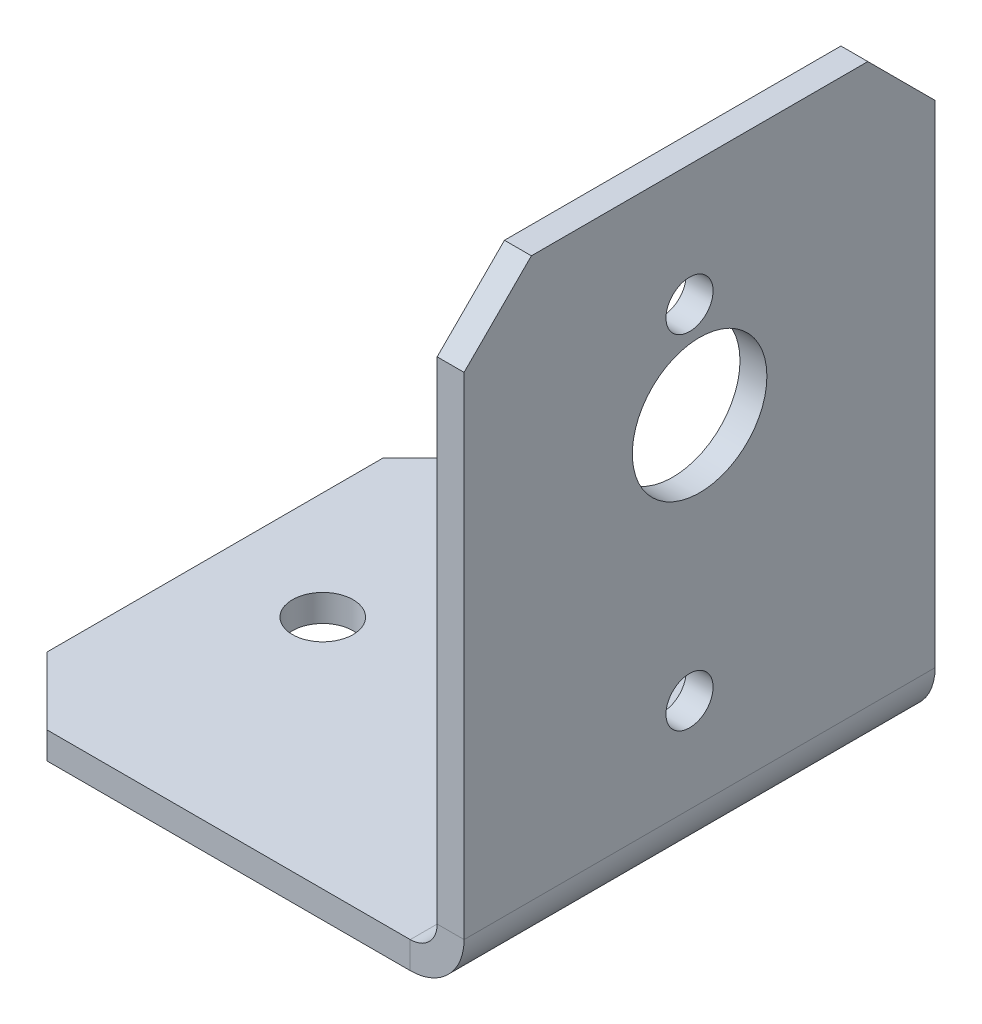
ISO-10303-21;
HEADER;
FILE_DESCRIPTION(('STEP AP214'),'2;1');
FILE_NAME('part.step','',(''),(''),'','','');
FILE_SCHEMA(('AUTOMOTIVE_DESIGN { 1 0 10303 214 1 1 1 1 }'));
ENDSEC;
DATA;
#1=APPLICATION_CONTEXT('core data for automotive mechanical design processes');
#2=APPLICATION_PROTOCOL_DEFINITION('international standard','automotive_design',2000,#1);
#3=PRODUCT_CONTEXT('',#1,'mechanical');
#4=PRODUCT('Part','Part','',(#3));
#5=PRODUCT_RELATED_PRODUCT_CATEGORY('part','',(#4));
#6=PRODUCT_DEFINITION_FORMATION('','',#4);
#7=PRODUCT_DEFINITION_CONTEXT('part definition',#1,'design');
#8=PRODUCT_DEFINITION('design','',#6,#7);
#9=PRODUCT_DEFINITION_SHAPE('','',#8);
#10=(LENGTH_UNIT() NAMED_UNIT(*) SI_UNIT(.MILLI.,.METRE.));
#11=(NAMED_UNIT(*) PLANE_ANGLE_UNIT() SI_UNIT($,.RADIAN.));
#12=(NAMED_UNIT(*) SI_UNIT($,.STERADIAN.) SOLID_ANGLE_UNIT());
#13=UNCERTAINTY_MEASURE_WITH_UNIT(LENGTH_MEASURE(1.E-05),#10,'distance_accuracy_value','');
#14=(GEOMETRIC_REPRESENTATION_CONTEXT(3) GLOBAL_UNCERTAINTY_ASSIGNED_CONTEXT((#13)) GLOBAL_UNIT_ASSIGNED_CONTEXT((#10,
#11,#12)) REPRESENTATION_CONTEXT('',''));
#15=CARTESIAN_POINT('',(0.,0.,0.));
#16=DIRECTION('',(0.,0.,1.));
#17=DIRECTION('',(1.,0.,0.));
#18=AXIS2_PLACEMENT_3D('',#15,#16,#17);
#19=CARTESIAN_POINT('',(-4.,0.,35.));
#20=DIRECTION('',(0.,0.,1.));
#21=DIRECTION('',(1.,0.,0.));
#22=AXIS2_PLACEMENT_3D('',#19,#20,#21);
#23=PLANE('',#22);
#24=DIRECTION('',(0.,1.,0.));
#25=VECTOR('',#24,1.);
#26=CARTESIAN_POINT('',(-4.,0.,35.));
#27=LINE('',#26,#25);
#28=CARTESIAN_POINT('',(-4.,0.,35.));
#29=VERTEX_POINT('',#28);
#30=CARTESIAN_POINT('',(-4.,2.,35.));
#31=VERTEX_POINT('',#30);
#32=EDGE_CURVE('E124',#29,#31,#27,.T.);
#33=ORIENTED_EDGE('',*,*,#32,.F.);
#34=CARTESIAN_POINT('',(-4.,4.,35.));
#35=DIRECTION('',(0.,0.,1.));
#36=DIRECTION('',(1.,0.,0.));
#37=AXIS2_PLACEMENT_3D('',#34,#35,#36);
#38=CIRCLE('',#37,4.);
#39=CARTESIAN_POINT('',(0.,4.,35.));
#40=VERTEX_POINT('',#39);
#41=EDGE_CURVE('E128',#40,#29,#38,.F.);
#42=ORIENTED_EDGE('',*,*,#41,.F.);
#43=DIRECTION('',(1.,0.,0.));
#44=VECTOR('',#43,1.);
#45=CARTESIAN_POINT('',(-2.,4.,35.));
#46=LINE('',#45,#44);
#47=CARTESIAN_POINT('',(-2.,4.,35.));
#48=VERTEX_POINT('',#47);
#49=EDGE_CURVE('E136',#48,#40,#46,.T.);
#50=ORIENTED_EDGE('',*,*,#49,.F.);
#51=CARTESIAN_POINT('',(-4.,4.,35.));
#52=DIRECTION('',(0.,0.,1.));
#53=DIRECTION('',(1.,0.,0.));
#54=AXIS2_PLACEMENT_3D('',#51,#52,#53);
#55=CIRCLE('',#54,2.);
#56=EDGE_CURVE('E130',#48,#31,#55,.F.);
#57=ORIENTED_EDGE('',*,*,#56,.T.);
#58=EDGE_LOOP('',(#33,#42,#50,#57));
#59=FACE_BOUND('',#58,.T.);
#60=ADVANCED_FACE('F34',(#59),#23,.T.);
#61=CARTESIAN_POINT('',(-2.,4.,35.));
#62=DIRECTION('',(0.,0.,1.));
#63=DIRECTION('',(1.,0.,0.));
#64=AXIS2_PLACEMENT_3D('',#61,#62,#63);
#65=PLANE('',#64);
#66=DIRECTION('',(-1.,0.,0.));
#67=VECTOR('',#66,1.);
#68=CARTESIAN_POINT('',(0.,2.,35.));
#69=LINE('',#68,#67);
#70=CARTESIAN_POINT('',(-31.,2.,35.));
#71=VERTEX_POINT('',#70);
#72=EDGE_CURVE('E158',#31,#71,#69,.T.);
#73=ORIENTED_EDGE('',*,*,#72,.T.);
#74=DIRECTION('',(0.,-1.,0.));
#75=VECTOR('',#74,1.);
#76=CARTESIAN_POINT('',(-31.,4.,35.));
#77=LINE('',#76,#75);
#78=CARTESIAN_POINT('',(-31.,0.,35.));
#79=VERTEX_POINT('',#78);
#80=EDGE_CURVE('E157',#71,#79,#77,.T.);
#81=ORIENTED_EDGE('',*,*,#80,.T.);
#82=DIRECTION('',(-1.,0.,0.));
#83=VECTOR('',#82,1.);
#84=CARTESIAN_POINT('',(0.,0.,35.));
#85=LINE('',#84,#83);
#86=EDGE_CURVE('E145',#29,#79,#85,.T.);
#87=ORIENTED_EDGE('',*,*,#86,.F.);
#88=ORIENTED_EDGE('',*,*,#32,.T.);
#89=EDGE_LOOP('',(#73,#81,#87,#88));
#90=FACE_BOUND('',#89,.T.);
#91=ADVANCED_FACE('F155',(#90),#65,.T.);
#92=CARTESIAN_POINT('',(0.,4.,0.));
#93=DIRECTION('',(0.,0.,-1.));
#94=DIRECTION('',(-1.,0.,0.));
#95=AXIS2_PLACEMENT_3D('',#92,#93,#94);
#96=PLANE('',#95);
#97=DIRECTION('',(-1.,0.,0.));
#98=VECTOR('',#97,1.);
#99=CARTESIAN_POINT('',(0.,4.,0.));
#100=LINE('',#99,#98);
#101=CARTESIAN_POINT('',(0.,4.,0.));
#102=VERTEX_POINT('',#101);
#103=CARTESIAN_POINT('',(-2.,4.,0.));
#104=VERTEX_POINT('',#103);
#105=EDGE_CURVE('E202',#102,#104,#100,.T.);
#106=ORIENTED_EDGE('',*,*,#105,.F.);
#107=CARTESIAN_POINT('',(-4.,4.,0.));
#108=DIRECTION('',(0.,0.,1.));
#109=DIRECTION('',(1.,0.,0.));
#110=AXIS2_PLACEMENT_3D('',#107,#108,#109);
#111=CIRCLE('',#110,4.);
#112=CARTESIAN_POINT('',(-4.,0.,0.));
#113=VERTEX_POINT('',#112);
#114=EDGE_CURVE('E177',#102,#113,#111,.F.);
#115=ORIENTED_EDGE('',*,*,#114,.T.);
#116=DIRECTION('',(0.,-1.,0.));
#117=VECTOR('',#116,1.);
#118=CARTESIAN_POINT('',(-4.,2.,0.));
#119=LINE('',#118,#117);
#120=CARTESIAN_POINT('',(-4.,2.,0.));
#121=VERTEX_POINT('',#120);
#122=EDGE_CURVE('E200',#121,#113,#119,.T.);
#123=ORIENTED_EDGE('',*,*,#122,.F.);
#124=CARTESIAN_POINT('',(-4.,4.,0.));
#125=DIRECTION('',(0.,0.,1.));
#126=DIRECTION('',(1.,0.,0.));
#127=AXIS2_PLACEMENT_3D('',#124,#125,#126);
#128=CIRCLE('',#127,2.);
#129=EDGE_CURVE('E183',#104,#121,#128,.F.);
#130=ORIENTED_EDGE('',*,*,#129,.F.);
#131=EDGE_LOOP('',(#106,#115,#123,#130));
#132=FACE_BOUND('',#131,.T.);
#133=ADVANCED_FACE('F318',(#132),#96,.T.);
#134=CARTESIAN_POINT('',(-4.,2.,0.));
#135=DIRECTION('',(0.,0.,-1.));
#136=DIRECTION('',(-1.,0.,0.));
#137=AXIS2_PLACEMENT_3D('',#134,#135,#136);
#138=PLANE('',#137);
#139=DIRECTION('',(0.,1.,0.));
#140=VECTOR('',#139,1.);
#141=CARTESIAN_POINT('',(-2.,0.,0.));
#142=LINE('',#141,#140);
#143=CARTESIAN_POINT('',(-2.,40.5,0.));
#144=VERTEX_POINT('',#143);
#145=EDGE_CURVE('E181',#144,#104,#142,.F.);
#146=ORIENTED_EDGE('',*,*,#145,.F.);
#147=DIRECTION('',(1.,0.,0.));
#148=VECTOR('',#147,1.);
#149=CARTESIAN_POINT('',(-4.,40.5,0.));
#150=LINE('',#149,#148);
#151=CARTESIAN_POINT('',(0.,40.5,0.));
#152=VERTEX_POINT('',#151);
#153=EDGE_CURVE('E234',#144,#152,#150,.T.);
#154=ORIENTED_EDGE('',*,*,#153,.T.);
#155=DIRECTION('',(0.,-1.,0.));
#156=VECTOR('',#155,1.);
#157=CARTESIAN_POINT('',(0.,0.,0.));
#158=LINE('',#157,#156);
#159=EDGE_CURVE('E179',#152,#102,#158,.T.);
#160=ORIENTED_EDGE('',*,*,#159,.T.);
#161=ORIENTED_EDGE('',*,*,#105,.T.);
#162=EDGE_LOOP('',(#146,#154,#160,#161));
#163=FACE_BOUND('',#162,.T.);
#164=ADVANCED_FACE('F254',(#163),#138,.T.);
#165=CARTESIAN_POINT('',(0.,2.,35.));
#166=DIRECTION('',(0.,-1.,0.));
#167=DIRECTION('',(1.,0.,0.));
#168=AXIS2_PLACEMENT_3D('',#165,#166,#167);
#169=PLANE('',#168);
#170=CARTESIAN_POINT('',(-12.,2.,17.5));
#171=DIRECTION('',(0.,-1.,0.));
#172=DIRECTION('',(1.,0.,0.));
#173=AXIS2_PLACEMENT_3D('',#170,#171,#172);
#174=CIRCLE('',#173,2.25);
#175=CARTESIAN_POINT('',(-9.75000000000001,2.,17.5));
#176=VERTEX_POINT('',#175);
#177=EDGE_CURVE('E287',#176,#176,#174,.T.);
#178=ORIENTED_EDGE('',*,*,#177,.T.);
#179=EDGE_LOOP('',(#178));
#180=FACE_BOUND('',#179,.T.);
#181=CARTESIAN_POINT('',(-28.,2.,17.5));
#182=DIRECTION('',(0.,-1.,0.));
#183=DIRECTION('',(1.,0.,0.));
#184=AXIS2_PLACEMENT_3D('',#181,#182,#183);
#185=CIRCLE('',#184,2.25);
#186=CARTESIAN_POINT('',(-25.75,2.,17.5));
#187=VERTEX_POINT('',#186);
#188=EDGE_CURVE('E281',#187,#187,#185,.T.);
#189=ORIENTED_EDGE('',*,*,#188,.T.);
#190=EDGE_LOOP('',(#189));
#191=FACE_BOUND('',#190,.T.);
#192=DIRECTION('',(-1.,0.,0.));
#193=VECTOR('',#192,1.);
#194=CARTESIAN_POINT('',(0.,2.,0.));
#195=LINE('',#194,#193);
#196=CARTESIAN_POINT('',(-31.,2.,0.));
#197=VERTEX_POINT('',#196);
#198=EDGE_CURVE('E172',#121,#197,#195,.T.);
#199=ORIENTED_EDGE('',*,*,#198,.T.);
#200=DIRECTION('',(-0.707106781186545,0.,0.70710678118655));
#201=VECTOR('',#200,1.);
#202=CARTESIAN_POINT('',(-31.,2.,0.));
#203=LINE('',#202,#201);
#204=CARTESIAN_POINT('',(-36.,2.,5.00000000000002));
#205=VERTEX_POINT('',#204);
#206=EDGE_CURVE('E222',#197,#205,#203,.T.);
#207=ORIENTED_EDGE('',*,*,#206,.T.);
#208=DIRECTION('',(0.,0.,-1.));
#209=VECTOR('',#208,1.);
#210=CARTESIAN_POINT('',(-36.,2.,35.));
#211=LINE('',#210,#209);
#212=CARTESIAN_POINT('',(-36.,2.,30.));
#213=VERTEX_POINT('',#212);
#214=EDGE_CURVE('E197',#213,#205,#211,.T.);
#215=ORIENTED_EDGE('',*,*,#214,.F.);
#216=DIRECTION('',(-0.707106781186549,0.,-0.707106781186546));
#217=VECTOR('',#216,1.);
#218=CARTESIAN_POINT('',(-36.,2.,30.));
#219=LINE('',#218,#217);
#220=EDGE_CURVE('E220',#213,#71,#219,.F.);
#221=ORIENTED_EDGE('',*,*,#220,.T.);
#222=ORIENTED_EDGE('',*,*,#72,.F.);
#223=DIRECTION('',(0.,0.,-1.));
#224=VECTOR('',#223,1.);
#225=CARTESIAN_POINT('',(-4.,2.,35.));
#226=LINE('',#225,#224);
#227=EDGE_CURVE('E171',#31,#121,#226,.T.);
#228=ORIENTED_EDGE('',*,*,#227,.T.);
#229=EDGE_LOOP('',(#199,#207,#215,#221,#222,#228));
#230=FACE_BOUND('',#229,.T.);
#231=ADVANCED_FACE('F272',(#180,#191,#230),#169,.F.);
#232=CARTESIAN_POINT('',(-36.,0.,35.));
#233=DIRECTION('',(-1.,0.,0.));
#234=DIRECTION('',(0.,0.,1.));
#235=AXIS2_PLACEMENT_3D('',#232,#233,#234);
#236=PLANE('',#235);
#237=ORIENTED_EDGE('',*,*,#214,.T.);
#238=DIRECTION('',(0.,-1.,0.));
#239=VECTOR('',#238,1.);
#240=CARTESIAN_POINT('',(-36.,0.,5.00000000000002));
#241=LINE('',#240,#239);
#242=CARTESIAN_POINT('',(-36.,0.,5.00000000000003));
#243=VERTEX_POINT('',#242);
#244=EDGE_CURVE('E227',#205,#243,#241,.T.);
#245=ORIENTED_EDGE('',*,*,#244,.T.);
#246=DIRECTION('',(0.,0.,-1.));
#247=VECTOR('',#246,1.);
#248=CARTESIAN_POINT('',(-36.,0.,35.));
#249=LINE('',#248,#247);
#250=CARTESIAN_POINT('',(-36.,0.,30.));
#251=VERTEX_POINT('',#250);
#252=EDGE_CURVE('E152',#251,#243,#249,.T.);
#253=ORIENTED_EDGE('',*,*,#252,.F.);
#254=DIRECTION('',(0.,1.,0.));
#255=VECTOR('',#254,1.);
#256=CARTESIAN_POINT('',(-36.,0.,30.));
#257=LINE('',#256,#255);
#258=EDGE_CURVE('E224',#251,#213,#257,.T.);
#259=ORIENTED_EDGE('',*,*,#258,.T.);
#260=EDGE_LOOP('',(#237,#245,#253,#259));
#261=FACE_BOUND('',#260,.T.);
#262=ADVANCED_FACE('F299',(#261),#236,.T.);
#263=CARTESIAN_POINT('',(0.,0.,35.));
#264=DIRECTION('',(0.,-1.,0.));
#265=DIRECTION('',(1.,0.,0.));
#266=AXIS2_PLACEMENT_3D('',#263,#264,#265);
#267=PLANE('',#266);
#268=CARTESIAN_POINT('',(-12.,0.,17.5));
#269=DIRECTION('',(0.,-1.,0.));
#270=DIRECTION('',(1.,0.,0.));
#271=AXIS2_PLACEMENT_3D('',#268,#269,#270);
#272=CIRCLE('',#271,2.25);
#273=CARTESIAN_POINT('',(-9.75000000000001,0.,17.5));
#274=VERTEX_POINT('',#273);
#275=EDGE_CURVE('E290',#274,#274,#272,.T.);
#276=ORIENTED_EDGE('',*,*,#275,.F.);
#277=EDGE_LOOP('',(#276));
#278=FACE_BOUND('',#277,.T.);
#279=CARTESIAN_POINT('',(-28.,0.,17.5));
#280=DIRECTION('',(0.,-1.,0.));
#281=DIRECTION('',(1.,0.,0.));
#282=AXIS2_PLACEMENT_3D('',#279,#280,#281);
#283=CIRCLE('',#282,2.25);
#284=CARTESIAN_POINT('',(-25.75,0.,17.5));
#285=VERTEX_POINT('',#284);
#286=EDGE_CURVE('E284',#285,#285,#283,.T.);
#287=ORIENTED_EDGE('',*,*,#286,.F.);
#288=EDGE_LOOP('',(#287));
#289=FACE_BOUND('',#288,.T.);
#290=ORIENTED_EDGE('',*,*,#252,.T.);
#291=DIRECTION('',(0.707106781186545,0.,-0.70710678118655));
#292=VECTOR('',#291,1.);
#293=CARTESIAN_POINT('',(-33.0000000000001,0.,2.00000000000012));
#294=LINE('',#293,#292);
#295=CARTESIAN_POINT('',(-31.,0.,0.));
#296=VERTEX_POINT('',#295);
#297=EDGE_CURVE('E231',#243,#296,#294,.T.);
#298=ORIENTED_EDGE('',*,*,#297,.T.);
#299=DIRECTION('',(-1.,0.,0.));
#300=VECTOR('',#299,1.);
#301=CARTESIAN_POINT('',(0.,0.,0.));
#302=LINE('',#301,#300);
#303=EDGE_CURVE('E148',#113,#296,#302,.T.);
#304=ORIENTED_EDGE('',*,*,#303,.F.);
#305=DIRECTION('',(0.,0.,-1.));
#306=VECTOR('',#305,1.);
#307=CARTESIAN_POINT('',(-4.,0.,35.));
#308=LINE('',#307,#306);
#309=EDGE_CURVE('E142',#29,#113,#308,.T.);
#310=ORIENTED_EDGE('',*,*,#309,.F.);
#311=ORIENTED_EDGE('',*,*,#86,.T.);
#312=DIRECTION('',(0.707106781186549,0.,0.707106781186546));
#313=VECTOR('',#312,1.);
#314=CARTESIAN_POINT('',(-15.4999999999999,0.,50.5));
#315=LINE('',#314,#313);
#316=EDGE_CURVE('E229',#79,#251,#315,.F.);
#317=ORIENTED_EDGE('',*,*,#316,.T.);
#318=EDGE_LOOP('',(#290,#298,#304,#310,#311,#317));
#319=FACE_BOUND('',#318,.T.);
#320=ADVANCED_FACE('F144',(#278,#289,#319),#267,.T.);
#321=CARTESIAN_POINT('',(-4.,4.,35.));
#322=DIRECTION('',(0.,0.,-1.));
#323=DIRECTION('',(-1.,0.,0.));
#324=AXIS2_PLACEMENT_3D('',#321,#322,#323);
#325=CYLINDRICAL_SURFACE('',#324,4.);
#326=ORIENTED_EDGE('',*,*,#114,.F.);
#327=DIRECTION('',(0.,0.,-1.));
#328=VECTOR('',#327,1.);
#329=CARTESIAN_POINT('',(0.,4.,35.));
#330=LINE('',#329,#328);
#331=EDGE_CURVE('E153',#40,#102,#330,.T.);
#332=ORIENTED_EDGE('',*,*,#331,.F.);
#333=ORIENTED_EDGE('',*,*,#41,.T.);
#334=ORIENTED_EDGE('',*,*,#309,.T.);
#335=EDGE_LOOP('',(#326,#332,#333,#334));
#336=FACE_BOUND('',#335,.T.);
#337=ADVANCED_FACE('F161',(#336),#325,.T.);
#338=CARTESIAN_POINT('',(0.,0.,35.));
#339=DIRECTION('',(1.,0.,0.));
#340=DIRECTION('',(0.,0.,-1.));
#341=AXIS2_PLACEMENT_3D('',#338,#339,#340);
#342=PLANE('',#341);
#343=CARTESIAN_POINT('',(0.,36.5,18.25));
#344=DIRECTION('',(1.,0.,0.));
#345=DIRECTION('',(0.,0.,-1.));
#346=AXIS2_PLACEMENT_3D('',#343,#344,#345);
#347=CIRCLE('',#346,1.75);
#348=CARTESIAN_POINT('',(0.,36.5,16.5));
#349=VERTEX_POINT('',#348);
#350=EDGE_CURVE('E217',#349,#349,#347,.T.);
#351=ORIENTED_EDGE('',*,*,#350,.F.);
#352=EDGE_LOOP('',(#351));
#353=FACE_BOUND('',#352,.T.);
#354=CARTESIAN_POINT('',(0.,11.,18.25));
#355=DIRECTION('',(1.,0.,0.));
#356=DIRECTION('',(0.,0.,-1.));
#357=AXIS2_PLACEMENT_3D('',#354,#355,#356);
#358=CIRCLE('',#357,1.75);
#359=CARTESIAN_POINT('',(0.,11.,16.5));
#360=VERTEX_POINT('',#359);
#361=EDGE_CURVE('E213',#360,#360,#358,.T.);
#362=ORIENTED_EDGE('',*,*,#361,.F.);
#363=EDGE_LOOP('',(#362));
#364=FACE_BOUND('',#363,.T.);
#365=CARTESIAN_POINT('',(0.,29.,17.5));
#366=DIRECTION('',(1.,0.,0.));
#367=DIRECTION('',(0.,0.,-1.));
#368=AXIS2_PLACEMENT_3D('',#365,#366,#367);
#369=CIRCLE('',#368,5.);
#370=CARTESIAN_POINT('',(0.,29.,12.5));
#371=VERTEX_POINT('',#370);
#372=EDGE_CURVE('E209',#371,#371,#369,.T.);
#373=ORIENTED_EDGE('',*,*,#372,.F.);
#374=EDGE_LOOP('',(#373));
#375=FACE_BOUND('',#374,.T.);
#376=ORIENTED_EDGE('',*,*,#159,.F.);
#377=DIRECTION('',(0.,-0.707106781186545,-0.70710678118655));
#378=VECTOR('',#377,1.);
#379=CARTESIAN_POINT('',(0.,37.7500000000001,-2.74999999999988));
#380=LINE('',#379,#378);
#381=CARTESIAN_POINT('',(0.,45.5,5.00000000000002));
#382=VERTEX_POINT('',#381);
#383=EDGE_CURVE('E239',#152,#382,#380,.F.);
#384=ORIENTED_EDGE('',*,*,#383,.T.);
#385=DIRECTION('',(0.,0.,-1.));
#386=VECTOR('',#385,1.);
#387=CARTESIAN_POINT('',(0.,45.5,35.));
#388=LINE('',#387,#386);
#389=CARTESIAN_POINT('',(0.,45.5,30.));
#390=VERTEX_POINT('',#389);
#391=EDGE_CURVE('E193',#390,#382,#388,.T.);
#392=ORIENTED_EDGE('',*,*,#391,.F.);
#393=DIRECTION('',(0.,0.70710678118655,-0.707106781186546));
#394=VECTOR('',#393,1.);
#395=CARTESIAN_POINT('',(0.,20.2499999999999,55.25));
#396=LINE('',#395,#394);
#397=CARTESIAN_POINT('',(0.,40.5,35.));
#398=VERTEX_POINT('',#397);
#399=EDGE_CURVE('E237',#390,#398,#396,.F.);
#400=ORIENTED_EDGE('',*,*,#399,.T.);
#401=DIRECTION('',(0.,-1.,0.));
#402=VECTOR('',#401,1.);
#403=CARTESIAN_POINT('',(0.,0.,35.));
#404=LINE('',#403,#402);
#405=EDGE_CURVE('E163',#398,#40,#404,.T.);
#406=ORIENTED_EDGE('',*,*,#405,.T.);
#407=ORIENTED_EDGE('',*,*,#331,.T.);
#408=EDGE_LOOP('',(#376,#384,#392,#400,#406,#407));
#409=FACE_BOUND('',#408,.T.);
#410=ADVANCED_FACE('F260',(#353,#364,#375,#409),#342,.T.);
#411=CARTESIAN_POINT('',(-2.,45.5,35.));
#412=DIRECTION('',(0.,1.,0.));
#413=DIRECTION('',(0.,0.,1.));
#414=AXIS2_PLACEMENT_3D('',#411,#412,#413);
#415=PLANE('',#414);
#416=ORIENTED_EDGE('',*,*,#391,.T.);
#417=DIRECTION('',(-1.,0.,0.));
#418=VECTOR('',#417,1.);
#419=CARTESIAN_POINT('',(-2.,45.5,5.00000000000002));
#420=LINE('',#419,#418);
#421=CARTESIAN_POINT('',(-2.,45.5,5.00000000000003));
#422=VERTEX_POINT('',#421);
#423=EDGE_CURVE('E55',#382,#422,#420,.T.);
#424=ORIENTED_EDGE('',*,*,#423,.T.);
#425=DIRECTION('',(0.,0.,-1.));
#426=VECTOR('',#425,1.);
#427=CARTESIAN_POINT('',(-2.,45.5,35.));
#428=LINE('',#427,#426);
#429=CARTESIAN_POINT('',(-2.,45.5,30.));
#430=VERTEX_POINT('',#429);
#431=EDGE_CURVE('E191',#430,#422,#428,.T.);
#432=ORIENTED_EDGE('',*,*,#431,.F.);
#433=DIRECTION('',(1.,0.,0.));
#434=VECTOR('',#433,1.);
#435=CARTESIAN_POINT('',(-2.,45.5,30.));
#436=LINE('',#435,#434);
#437=EDGE_CURVE('E241',#430,#390,#436,.T.);
#438=ORIENTED_EDGE('',*,*,#437,.T.);
#439=EDGE_LOOP('',(#416,#424,#432,#438));
#440=FACE_BOUND('',#439,.T.);
#441=ADVANCED_FACE('F261',(#440),#415,.T.);
#442=CARTESIAN_POINT('',(-2.,0.,35.));
#443=DIRECTION('',(1.,0.,0.));
#444=DIRECTION('',(0.,0.,-1.));
#445=AXIS2_PLACEMENT_3D('',#442,#443,#444);
#446=PLANE('',#445);
#447=CARTESIAN_POINT('',(-2.,36.5,18.25));
#448=DIRECTION('',(1.,0.,0.));
#449=DIRECTION('',(0.,0.,-1.));
#450=AXIS2_PLACEMENT_3D('',#447,#448,#449);
#451=CIRCLE('',#450,1.75);
#452=CARTESIAN_POINT('',(-2.,36.5,16.5));
#453=VERTEX_POINT('',#452);
#454=EDGE_CURVE('E214',#453,#453,#451,.T.);
#455=ORIENTED_EDGE('',*,*,#454,.T.);
#456=EDGE_LOOP('',(#455));
#457=FACE_BOUND('',#456,.T.);
#458=CARTESIAN_POINT('',(-2.,11.,18.25));
#459=DIRECTION('',(1.,0.,0.));
#460=DIRECTION('',(0.,0.,-1.));
#461=AXIS2_PLACEMENT_3D('',#458,#459,#460);
#462=CIRCLE('',#461,1.75);
#463=CARTESIAN_POINT('',(-2.,11.,16.5));
#464=VERTEX_POINT('',#463);
#465=EDGE_CURVE('E210',#464,#464,#462,.T.);
#466=ORIENTED_EDGE('',*,*,#465,.T.);
#467=EDGE_LOOP('',(#466));
#468=FACE_BOUND('',#467,.T.);
#469=CARTESIAN_POINT('',(-2.,29.,17.5));
#470=DIRECTION('',(1.,0.,0.));
#471=DIRECTION('',(0.,0.,-1.));
#472=AXIS2_PLACEMENT_3D('',#469,#470,#471);
#473=CIRCLE('',#472,5.);
#474=CARTESIAN_POINT('',(-2.,29.,12.5));
#475=VERTEX_POINT('',#474);
#476=EDGE_CURVE('E175',#475,#475,#473,.T.);
#477=ORIENTED_EDGE('',*,*,#476,.T.);
#478=EDGE_LOOP('',(#477));
#479=FACE_BOUND('',#478,.T.);
#480=ORIENTED_EDGE('',*,*,#431,.T.);
#481=DIRECTION('',(0.,0.707106781186545,0.70710678118655));
#482=VECTOR('',#481,1.);
#483=CARTESIAN_POINT('',(-2.,40.5,0.));
#484=LINE('',#483,#482);
#485=EDGE_CURVE('E42',#422,#144,#484,.F.);
#486=ORIENTED_EDGE('',*,*,#485,.T.);
#487=ORIENTED_EDGE('',*,*,#145,.T.);
#488=DIRECTION('',(0.,0.,-1.));
#489=VECTOR('',#488,1.);
#490=CARTESIAN_POINT('',(-2.,4.,35.));
#491=LINE('',#490,#489);
#492=EDGE_CURVE('E188',#48,#104,#491,.T.);
#493=ORIENTED_EDGE('',*,*,#492,.F.);
#494=DIRECTION('',(0.,1.,0.));
#495=VECTOR('',#494,1.);
#496=CARTESIAN_POINT('',(-2.,0.,35.));
#497=LINE('',#496,#495);
#498=CARTESIAN_POINT('',(-2.,40.5,35.));
#499=VERTEX_POINT('',#498);
#500=EDGE_CURVE('E165',#499,#48,#497,.F.);
#501=ORIENTED_EDGE('',*,*,#500,.F.);
#502=DIRECTION('',(0.,-0.70710678118655,0.707106781186546));
#503=VECTOR('',#502,1.);
#504=CARTESIAN_POINT('',(-2.,45.5,30.));
#505=LINE('',#504,#503);
#506=EDGE_CURVE('E245',#499,#430,#505,.F.);
#507=ORIENTED_EDGE('',*,*,#506,.T.);
#508=EDGE_LOOP('',(#480,#486,#487,#493,#501,#507));
#509=FACE_BOUND('',#508,.T.);
#510=ADVANCED_FACE('F249',(#457,#468,#479,#509),#446,.F.);
#511=CARTESIAN_POINT('',(-4.,4.,35.));
#512=DIRECTION('',(0.,0.,-1.));
#513=DIRECTION('',(-1.,0.,0.));
#514=AXIS2_PLACEMENT_3D('',#511,#512,#513);
#515=CYLINDRICAL_SURFACE('',#514,2.);
#516=ORIENTED_EDGE('',*,*,#129,.T.);
#517=ORIENTED_EDGE('',*,*,#227,.F.);
#518=ORIENTED_EDGE('',*,*,#56,.F.);
#519=ORIENTED_EDGE('',*,*,#492,.T.);
#520=EDGE_LOOP('',(#516,#517,#518,#519));
#521=FACE_BOUND('',#520,.T.);
#522=ADVANCED_FACE('F268',(#521),#515,.F.);
#523=CARTESIAN_POINT('',(-4.,4.,35.));
#524=DIRECTION('',(0.,0.,1.));
#525=DIRECTION('',(1.,0.,0.));
#526=AXIS2_PLACEMENT_3D('',#523,#524,#525);
#527=PLANE('',#526);
#528=ORIENTED_EDGE('',*,*,#405,.F.);
#529=DIRECTION('',(-1.,0.,0.));
#530=VECTOR('',#529,1.);
#531=CARTESIAN_POINT('',(-4.,40.5,35.));
#532=LINE('',#531,#530);
#533=EDGE_CURVE('E11',#398,#499,#532,.T.);
#534=ORIENTED_EDGE('',*,*,#533,.T.);
#535=ORIENTED_EDGE('',*,*,#500,.T.);
#536=ORIENTED_EDGE('',*,*,#49,.T.);
#537=EDGE_LOOP('',(#528,#534,#535,#536));
#538=FACE_BOUND('',#537,.T.);
#539=ADVANCED_FACE('F265',(#538),#527,.T.);
#540=CARTESIAN_POINT('',(-4.,4.,0.));
#541=DIRECTION('',(0.,0.,1.));
#542=DIRECTION('',(1.,0.,0.));
#543=AXIS2_PLACEMENT_3D('',#540,#541,#542);
#544=PLANE('',#543);
#545=ORIENTED_EDGE('',*,*,#303,.T.);
#546=DIRECTION('',(0.,1.,0.));
#547=VECTOR('',#546,1.);
#548=CARTESIAN_POINT('',(-31.,2.,0.));
#549=LINE('',#548,#547);
#550=EDGE_CURVE('E135',#296,#197,#549,.T.);
#551=ORIENTED_EDGE('',*,*,#550,.T.);
#552=ORIENTED_EDGE('',*,*,#198,.F.);
#553=ORIENTED_EDGE('',*,*,#122,.T.);
#554=EDGE_LOOP('',(#545,#551,#552,#553));
#555=FACE_BOUND('',#554,.T.);
#556=ADVANCED_FACE('F410',(#555),#544,.F.);
#557=CARTESIAN_POINT('',(-10.,29.,17.5));
#558=DIRECTION('',(1.,0.,0.));
#559=DIRECTION('',(0.,0.,-1.));
#560=AXIS2_PLACEMENT_3D('',#557,#558,#559);
#561=CYLINDRICAL_SURFACE('',#560,5.);
#562=ORIENTED_EDGE('',*,*,#372,.T.);
#563=EDGE_LOOP('',(#562));
#564=FACE_BOUND('',#563,.T.);
#565=ORIENTED_EDGE('',*,*,#476,.F.);
#566=EDGE_LOOP('',(#565));
#567=FACE_BOUND('',#566,.T.);
#568=ADVANCED_FACE('F399',(#564,#567),#561,.F.);
#569=CARTESIAN_POINT('',(-10.,11.,18.25));
#570=DIRECTION('',(1.,0.,0.));
#571=DIRECTION('',(0.,0.,-1.));
#572=AXIS2_PLACEMENT_3D('',#569,#570,#571);
#573=CYLINDRICAL_SURFACE('',#572,1.75);
#574=ORIENTED_EDGE('',*,*,#361,.T.);
#575=EDGE_LOOP('',(#574));
#576=FACE_BOUND('',#575,.T.);
#577=ORIENTED_EDGE('',*,*,#465,.F.);
#578=EDGE_LOOP('',(#577));
#579=FACE_BOUND('',#578,.T.);
#580=ADVANCED_FACE('F387',(#576,#579),#573,.F.);
#581=CARTESIAN_POINT('',(-10.,36.5,18.25));
#582=DIRECTION('',(1.,0.,0.));
#583=DIRECTION('',(0.,0.,-1.));
#584=AXIS2_PLACEMENT_3D('',#581,#582,#583);
#585=CYLINDRICAL_SURFACE('',#584,1.75);
#586=ORIENTED_EDGE('',*,*,#350,.T.);
#587=EDGE_LOOP('',(#586));
#588=FACE_BOUND('',#587,.T.);
#589=ORIENTED_EDGE('',*,*,#454,.F.);
#590=EDGE_LOOP('',(#589));
#591=FACE_BOUND('',#590,.T.);
#592=ADVANCED_FACE('F332',(#588,#591),#585,.F.);
#593=CARTESIAN_POINT('',(-31.,4.,0.));
#594=DIRECTION('',(-0.70710678118655,0.,-0.707106781186545));
#595=DIRECTION('',(-0.707106781186545,0.,0.70710678118655));
#596=AXIS2_PLACEMENT_3D('',#593,#594,#595);
#597=PLANE('',#596);
#598=ORIENTED_EDGE('',*,*,#297,.F.);
#599=ORIENTED_EDGE('',*,*,#244,.F.);
#600=ORIENTED_EDGE('',*,*,#206,.F.);
#601=ORIENTED_EDGE('',*,*,#550,.F.);
#602=EDGE_LOOP('',(#598,#599,#600,#601));
#603=FACE_BOUND('',#602,.T.);
#604=ADVANCED_FACE('F328',(#603),#597,.T.);
#605=CARTESIAN_POINT('',(-36.,0.,30.));
#606=DIRECTION('',(0.707106781186546,0.,-0.707106781186549));
#607=DIRECTION('',(-0.707106781186549,0.,-0.707106781186546));
#608=AXIS2_PLACEMENT_3D('',#605,#606,#607);
#609=PLANE('',#608);
#610=ORIENTED_EDGE('',*,*,#316,.F.);
#611=ORIENTED_EDGE('',*,*,#80,.F.);
#612=ORIENTED_EDGE('',*,*,#220,.F.);
#613=ORIENTED_EDGE('',*,*,#258,.F.);
#614=EDGE_LOOP('',(#610,#611,#612,#613));
#615=FACE_BOUND('',#614,.T.);
#616=ADVANCED_FACE('F331',(#615),#609,.F.);
#617=CARTESIAN_POINT('',(-4.,40.5,0.));
#618=DIRECTION('',(0.,-0.70710678118655,0.707106781186545));
#619=DIRECTION('',(0.,-0.707106781186545,-0.70710678118655));
#620=AXIS2_PLACEMENT_3D('',#617,#618,#619);
#621=PLANE('',#620);
#622=ORIENTED_EDGE('',*,*,#485,.F.);
#623=ORIENTED_EDGE('',*,*,#423,.F.);
#624=ORIENTED_EDGE('',*,*,#383,.F.);
#625=ORIENTED_EDGE('',*,*,#153,.F.);
#626=EDGE_LOOP('',(#622,#623,#624,#625));
#627=FACE_BOUND('',#626,.T.);
#628=ADVANCED_FACE('F257',(#627),#621,.F.);
#629=CARTESIAN_POINT('',(-2.,45.5,30.));
#630=DIRECTION('',(0.,-0.707106781186546,-0.70710678118655));
#631=DIRECTION('',(0.,0.70710678118655,-0.707106781186546));
#632=AXIS2_PLACEMENT_3D('',#629,#630,#631);
#633=PLANE('',#632);
#634=ORIENTED_EDGE('',*,*,#506,.F.);
#635=ORIENTED_EDGE('',*,*,#533,.F.);
#636=ORIENTED_EDGE('',*,*,#399,.F.);
#637=ORIENTED_EDGE('',*,*,#437,.F.);
#638=EDGE_LOOP('',(#634,#635,#636,#637));
#639=FACE_BOUND('',#638,.T.);
#640=ADVANCED_FACE('F36',(#639),#633,.F.);
#641=CARTESIAN_POINT('',(-28.,10.,17.5));
#642=DIRECTION('',(0.,-1.,0.));
#643=DIRECTION('',(1.,0.,0.));
#644=AXIS2_PLACEMENT_3D('',#641,#642,#643);
#645=CYLINDRICAL_SURFACE('',#644,2.25);
#646=ORIENTED_EDGE('',*,*,#286,.T.);
#647=EDGE_LOOP('',(#646));
#648=FACE_BOUND('',#647,.T.);
#649=ORIENTED_EDGE('',*,*,#188,.F.);
#650=EDGE_LOOP('',(#649));
#651=FACE_BOUND('',#650,.T.);
#652=ADVANCED_FACE('F303',(#648,#651),#645,.F.);
#653=CARTESIAN_POINT('',(-12.,10.,17.5));
#654=DIRECTION('',(0.,-1.,0.));
#655=DIRECTION('',(1.,0.,0.));
#656=AXIS2_PLACEMENT_3D('',#653,#654,#655);
#657=CYLINDRICAL_SURFACE('',#656,2.25);
#658=ORIENTED_EDGE('',*,*,#275,.T.);
#659=EDGE_LOOP('',(#658));
#660=FACE_BOUND('',#659,.T.);
#661=ORIENTED_EDGE('',*,*,#177,.F.);
#662=EDGE_LOOP('',(#661));
#663=FACE_BOUND('',#662,.T.);
#664=ADVANCED_FACE('F294',(#660,#663),#657,.F.);
#665=CLOSED_SHELL('',(#60,#91,#133,#164,#231,#262,#320,#337,#410,#441,#510,#522,#539,#556,#568,
#580,#592,#604,#616,#628,#640,#652,#664));
#666=MANIFOLD_SOLID_BREP('B2',#665);
#667=ADVANCED_BREP_SHAPE_REPRESENTATION('',(#18,#666),#14);
#668=SHAPE_DEFINITION_REPRESENTATION(#9,#667);
ENDSEC;
END-ISO-10303-21;
